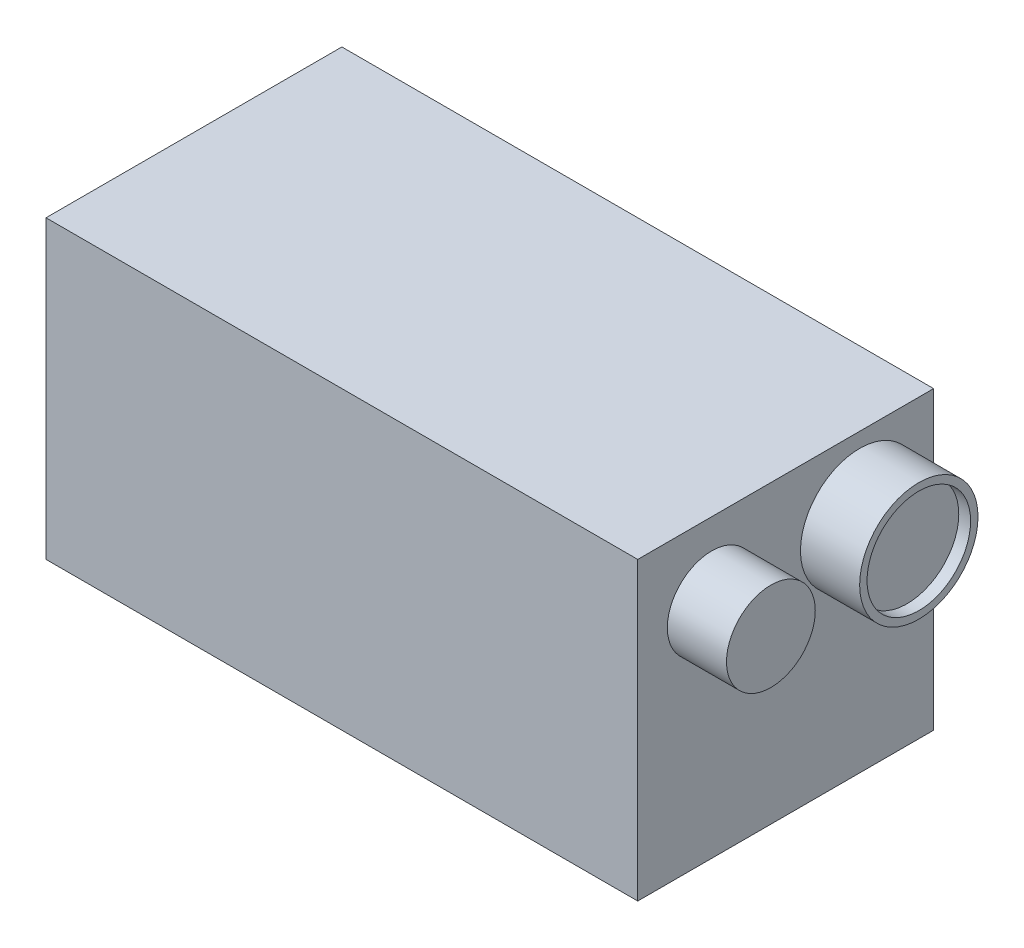
ISO-10303-21;
HEADER;
FILE_DESCRIPTION(('STEP AP214'),'2;1');
FILE_NAME('part.step','',(''),(''),'','','');
FILE_SCHEMA(('AUTOMOTIVE_DESIGN { 1 0 10303 214 1 1 1 1 }'));
ENDSEC;
DATA;
#1=APPLICATION_CONTEXT('core data for automotive mechanical design processes');
#2=APPLICATION_PROTOCOL_DEFINITION('international standard','automotive_design',2000,#1);
#3=PRODUCT_CONTEXT('',#1,'mechanical');
#4=PRODUCT('Part','Part','',(#3));
#5=PRODUCT_RELATED_PRODUCT_CATEGORY('part','',(#4));
#6=PRODUCT_DEFINITION_FORMATION('','',#4);
#7=PRODUCT_DEFINITION_CONTEXT('part definition',#1,'design');
#8=PRODUCT_DEFINITION('design','',#6,#7);
#9=PRODUCT_DEFINITION_SHAPE('','',#8);
#10=(LENGTH_UNIT() NAMED_UNIT(*) SI_UNIT(.MILLI.,.METRE.));
#11=(NAMED_UNIT(*) PLANE_ANGLE_UNIT() SI_UNIT($,.RADIAN.));
#12=(NAMED_UNIT(*) SI_UNIT($,.STERADIAN.) SOLID_ANGLE_UNIT());
#13=UNCERTAINTY_MEASURE_WITH_UNIT(LENGTH_MEASURE(1.E-05),#10,'distance_accuracy_value','');
#14=(GEOMETRIC_REPRESENTATION_CONTEXT(3) GLOBAL_UNCERTAINTY_ASSIGNED_CONTEXT((#13)) GLOBAL_UNIT_ASSIGNED_CONTEXT((#10,
#11,#12)) REPRESENTATION_CONTEXT('',''));
#15=CARTESIAN_POINT('',(0.,0.,0.));
#16=DIRECTION('',(0.,0.,1.));
#17=DIRECTION('',(1.,0.,0.));
#18=AXIS2_PLACEMENT_3D('',#15,#16,#17);
#19=CARTESIAN_POINT('',(-50.,-25.,25.));
#20=DIRECTION('',(1.,0.,0.));
#21=DIRECTION('',(0.,0.,-1.));
#22=AXIS2_PLACEMENT_3D('',#19,#20,#21);
#23=PLANE('',#22);
#24=DIRECTION('',(0.,-1.,0.));
#25=VECTOR('',#24,1.);
#26=CARTESIAN_POINT('',(-50.,-25.,-25.));
#27=LINE('',#26,#25);
#28=CARTESIAN_POINT('',(-50.,25.,-25.));
#29=VERTEX_POINT('',#28);
#30=CARTESIAN_POINT('',(-50.,-25.,-25.));
#31=VERTEX_POINT('',#30);
#32=EDGE_CURVE('E111',#29,#31,#27,.T.);
#33=ORIENTED_EDGE('',*,*,#32,.T.);
#34=DIRECTION('',(0.,0.,-1.));
#35=VECTOR('',#34,1.);
#36=CARTESIAN_POINT('',(-50.,-25.,25.));
#37=LINE('',#36,#35);
#38=CARTESIAN_POINT('',(-50.,-25.,25.));
#39=VERTEX_POINT('',#38);
#40=EDGE_CURVE('E100',#39,#31,#37,.T.);
#41=ORIENTED_EDGE('',*,*,#40,.F.);
#42=DIRECTION('',(0.,-1.,0.));
#43=VECTOR('',#42,1.);
#44=CARTESIAN_POINT('',(-50.,-25.,25.));
#45=LINE('',#44,#43);
#46=CARTESIAN_POINT('',(-50.,25.,25.));
#47=VERTEX_POINT('',#46);
#48=EDGE_CURVE('E92',#47,#39,#45,.T.);
#49=ORIENTED_EDGE('',*,*,#48,.F.);
#50=DIRECTION('',(0.,0.,-1.));
#51=VECTOR('',#50,1.);
#52=CARTESIAN_POINT('',(-50.,25.,25.));
#53=LINE('',#52,#51);
#54=EDGE_CURVE('E107',#47,#29,#53,.T.);
#55=ORIENTED_EDGE('',*,*,#54,.T.);
#56=EDGE_LOOP('',(#33,#41,#49,#55));
#57=FACE_BOUND('',#56,.T.);
#58=ADVANCED_FACE('F39',(#57),#23,.F.);
#59=CARTESIAN_POINT('',(50.,-25.,25.));
#60=DIRECTION('',(0.,1.,0.));
#61=DIRECTION('',(-1.,0.,0.));
#62=AXIS2_PLACEMENT_3D('',#59,#60,#61);
#63=PLANE('',#62);
#64=DIRECTION('',(1.,0.,0.));
#65=VECTOR('',#64,1.);
#66=CARTESIAN_POINT('',(50.,-25.,-25.));
#67=LINE('',#66,#65);
#68=CARTESIAN_POINT('',(50.,-25.,-25.));
#69=VERTEX_POINT('',#68);
#70=EDGE_CURVE('E98',#31,#69,#67,.T.);
#71=ORIENTED_EDGE('',*,*,#70,.T.);
#72=DIRECTION('',(0.,0.,-1.));
#73=VECTOR('',#72,1.);
#74=CARTESIAN_POINT('',(50.,-25.,25.));
#75=LINE('',#74,#73);
#76=CARTESIAN_POINT('',(50.,-25.,25.));
#77=VERTEX_POINT('',#76);
#78=EDGE_CURVE('E96',#77,#69,#75,.T.);
#79=ORIENTED_EDGE('',*,*,#78,.F.);
#80=DIRECTION('',(1.,0.,0.));
#81=VECTOR('',#80,1.);
#82=CARTESIAN_POINT('',(50.,-25.,25.));
#83=LINE('',#82,#81);
#84=EDGE_CURVE('E87',#39,#77,#83,.T.);
#85=ORIENTED_EDGE('',*,*,#84,.F.);
#86=ORIENTED_EDGE('',*,*,#40,.T.);
#87=EDGE_LOOP('',(#71,#79,#85,#86));
#88=FACE_BOUND('',#87,.T.);
#89=ADVANCED_FACE('F97',(#88),#63,.F.);
#90=CARTESIAN_POINT('',(50.,-25.,25.));
#91=DIRECTION('',(-1.,0.,0.));
#92=DIRECTION('',(0.,0.,1.));
#93=AXIS2_PLACEMENT_3D('',#90,#91,#92);
#94=PLANE('',#93);
#95=CARTESIAN_POINT('',(50.,12.5,-12.5));
#96=DIRECTION('',(-1.,0.,0.));
#97=DIRECTION('',(0.,0.,1.));
#98=AXIS2_PLACEMENT_3D('',#95,#96,#97);
#99=CIRCLE('',#98,10.);
#100=CARTESIAN_POINT('',(50.,12.5,-2.5));
#101=VERTEX_POINT('',#100);
#102=EDGE_CURVE('E11',#101,#101,#99,.F.);
#103=ORIENTED_EDGE('',*,*,#102,.F.);
#104=EDGE_LOOP('',(#103));
#105=FACE_BOUND('',#104,.T.);
#106=CARTESIAN_POINT('',(50.,12.5,12.5));
#107=DIRECTION('',(-1.,0.,0.));
#108=DIRECTION('',(0.,0.,1.));
#109=AXIS2_PLACEMENT_3D('',#106,#107,#108);
#110=CIRCLE('',#109,7.5);
#111=CARTESIAN_POINT('',(50.,12.5,20.));
#112=VERTEX_POINT('',#111);
#113=EDGE_CURVE('E48',#112,#112,#110,.F.);
#114=ORIENTED_EDGE('',*,*,#113,.F.);
#115=EDGE_LOOP('',(#114));
#116=FACE_BOUND('',#115,.T.);
#117=DIRECTION('',(0.,1.,0.));
#118=VECTOR('',#117,1.);
#119=CARTESIAN_POINT('',(50.,-25.,-25.));
#120=LINE('',#119,#118);
#121=CARTESIAN_POINT('',(50.,25.,-25.));
#122=VERTEX_POINT('',#121);
#123=EDGE_CURVE('E73',#69,#122,#120,.T.);
#124=ORIENTED_EDGE('',*,*,#123,.T.);
#125=DIRECTION('',(0.,0.,-1.));
#126=VECTOR('',#125,1.);
#127=CARTESIAN_POINT('',(50.,25.,25.));
#128=LINE('',#127,#126);
#129=CARTESIAN_POINT('',(50.,25.,25.));
#130=VERTEX_POINT('',#129);
#131=EDGE_CURVE('E101',#130,#122,#128,.T.);
#132=ORIENTED_EDGE('',*,*,#131,.F.);
#133=DIRECTION('',(0.,1.,0.));
#134=VECTOR('',#133,1.);
#135=CARTESIAN_POINT('',(50.,-25.,25.));
#136=LINE('',#135,#134);
#137=EDGE_CURVE('E90',#77,#130,#136,.T.);
#138=ORIENTED_EDGE('',*,*,#137,.F.);
#139=ORIENTED_EDGE('',*,*,#78,.T.);
#140=EDGE_LOOP('',(#124,#132,#138,#139));
#141=FACE_BOUND('',#140,.T.);
#142=ADVANCED_FACE('F103',(#105,#116,#141),#94,.F.);
#143=CARTESIAN_POINT('',(50.,25.,25.));
#144=DIRECTION('',(0.,-1.,0.));
#145=DIRECTION('',(1.,0.,0.));
#146=AXIS2_PLACEMENT_3D('',#143,#144,#145);
#147=PLANE('',#146);
#148=DIRECTION('',(-1.,0.,0.));
#149=VECTOR('',#148,1.);
#150=CARTESIAN_POINT('',(50.,25.,-25.));
#151=LINE('',#150,#149);
#152=EDGE_CURVE('E79',#122,#29,#151,.T.);
#153=ORIENTED_EDGE('',*,*,#152,.T.);
#154=ORIENTED_EDGE('',*,*,#54,.F.);
#155=DIRECTION('',(-1.,0.,0.));
#156=VECTOR('',#155,1.);
#157=CARTESIAN_POINT('',(50.,25.,25.));
#158=LINE('',#157,#156);
#159=EDGE_CURVE('E56',#130,#47,#158,.T.);
#160=ORIENTED_EDGE('',*,*,#159,.F.);
#161=ORIENTED_EDGE('',*,*,#131,.T.);
#162=EDGE_LOOP('',(#153,#154,#160,#161));
#163=FACE_BOUND('',#162,.T.);
#164=ADVANCED_FACE('F134',(#163),#147,.F.);
#165=CARTESIAN_POINT('',(0.,0.,25.));
#166=DIRECTION('',(0.,0.,1.));
#167=DIRECTION('',(1.,0.,0.));
#168=AXIS2_PLACEMENT_3D('',#165,#166,#167);
#169=PLANE('',#168);
#170=ORIENTED_EDGE('',*,*,#48,.T.);
#171=ORIENTED_EDGE('',*,*,#84,.T.);
#172=ORIENTED_EDGE('',*,*,#137,.T.);
#173=ORIENTED_EDGE('',*,*,#159,.T.);
#174=EDGE_LOOP('',(#170,#171,#172,#173));
#175=FACE_BOUND('',#174,.T.);
#176=ADVANCED_FACE('F88',(#175),#169,.T.);
#177=CARTESIAN_POINT('',(0.,0.,-25.));
#178=DIRECTION('',(0.,0.,1.));
#179=DIRECTION('',(1.,0.,0.));
#180=AXIS2_PLACEMENT_3D('',#177,#178,#179);
#181=PLANE('',#180);
#182=ORIENTED_EDGE('',*,*,#32,.F.);
#183=ORIENTED_EDGE('',*,*,#152,.F.);
#184=ORIENTED_EDGE('',*,*,#123,.F.);
#185=ORIENTED_EDGE('',*,*,#70,.F.);
#186=EDGE_LOOP('',(#182,#183,#184,#185));
#187=FACE_BOUND('',#186,.T.);
#188=ADVANCED_FACE('F149',(#187),#181,.F.);
#189=CARTESIAN_POINT('',(60.,12.5,12.5));
#190=DIRECTION('',(-1.,0.,0.));
#191=DIRECTION('',(0.,0.,1.));
#192=AXIS2_PLACEMENT_3D('',#189,#190,#191);
#193=CYLINDRICAL_SURFACE('',#192,7.5);
#194=CARTESIAN_POINT('',(60.,12.5,12.5));
#195=DIRECTION('',(1.,0.,0.));
#196=DIRECTION('',(0.,0.,-1.));
#197=AXIS2_PLACEMENT_3D('',#194,#195,#196);
#198=CIRCLE('',#197,7.5);
#199=CARTESIAN_POINT('',(60.,12.5,5.));
#200=VERTEX_POINT('',#199);
#201=EDGE_CURVE('E115',#200,#200,#198,.T.);
#202=ORIENTED_EDGE('',*,*,#201,.F.);
#203=EDGE_LOOP('',(#202));
#204=FACE_BOUND('',#203,.T.);
#205=ORIENTED_EDGE('',*,*,#113,.T.);
#206=EDGE_LOOP('',(#205));
#207=FACE_BOUND('',#206,.T.);
#208=ADVANCED_FACE('F131',(#204,#207),#193,.T.);
#209=CARTESIAN_POINT('',(60.,12.5,12.5));
#210=DIRECTION('',(1.,0.,0.));
#211=DIRECTION('',(0.,0.,-1.));
#212=AXIS2_PLACEMENT_3D('',#209,#210,#211);
#213=PLANE('',#212);
#214=ORIENTED_EDGE('',*,*,#201,.T.);
#215=EDGE_LOOP('',(#214));
#216=FACE_BOUND('',#215,.T.);
#217=ADVANCED_FACE('F156',(#216),#213,.T.);
#218=CARTESIAN_POINT('',(60.,12.5,-12.5));
#219=DIRECTION('',(-1.,0.,0.));
#220=DIRECTION('',(0.,0.,1.));
#221=AXIS2_PLACEMENT_3D('',#218,#219,#220);
#222=CYLINDRICAL_SURFACE('',#221,10.);
#223=CARTESIAN_POINT('',(60.,12.5,-12.5));
#224=DIRECTION('',(1.,0.,0.));
#225=DIRECTION('',(0.,0.,-1.));
#226=AXIS2_PLACEMENT_3D('',#223,#224,#225);
#227=CIRCLE('',#226,10.);
#228=CARTESIAN_POINT('',(60.,12.5,-22.5));
#229=VERTEX_POINT('',#228);
#230=EDGE_CURVE('E185',#229,#229,#227,.T.);
#231=ORIENTED_EDGE('',*,*,#230,.F.);
#232=EDGE_LOOP('',(#231));
#233=FACE_BOUND('',#232,.T.);
#234=ORIENTED_EDGE('',*,*,#102,.T.);
#235=EDGE_LOOP('',(#234));
#236=FACE_BOUND('',#235,.T.);
#237=ADVANCED_FACE('F163',(#233,#236),#222,.T.);
#238=CARTESIAN_POINT('',(60.,12.5,-12.5));
#239=DIRECTION('',(1.,0.,0.));
#240=DIRECTION('',(0.,0.,-1.));
#241=AXIS2_PLACEMENT_3D('',#238,#239,#240);
#242=PLANE('',#241);
#243=CARTESIAN_POINT('',(60.,12.5,-12.5));
#244=DIRECTION('',(1.,0.,0.));
#245=DIRECTION('',(0.,0.,-1.));
#246=AXIS2_PLACEMENT_3D('',#243,#244,#245);
#247=CIRCLE('',#246,8.75);
#248=CARTESIAN_POINT('',(60.,12.5,-21.25));
#249=VERTEX_POINT('',#248);
#250=EDGE_CURVE('E186',#249,#249,#247,.T.);
#251=ORIENTED_EDGE('',*,*,#250,.F.);
#252=EDGE_LOOP('',(#251));
#253=FACE_BOUND('',#252,.T.);
#254=ORIENTED_EDGE('',*,*,#230,.T.);
#255=EDGE_LOOP('',(#254));
#256=FACE_BOUND('',#255,.T.);
#257=ADVANCED_FACE('F165',(#253,#256),#242,.T.);
#258=CARTESIAN_POINT('',(58.,12.5,-12.5));
#259=DIRECTION('',(1.,0.,0.));
#260=DIRECTION('',(0.,0.,-1.));
#261=AXIS2_PLACEMENT_3D('',#258,#259,#260);
#262=CYLINDRICAL_SURFACE('',#261,8.75);
#263=CARTESIAN_POINT('',(58.,12.5,-12.5));
#264=DIRECTION('',(1.,0.,0.));
#265=DIRECTION('',(0.,0.,-1.));
#266=AXIS2_PLACEMENT_3D('',#263,#264,#265);
#267=CIRCLE('',#266,8.75);
#268=CARTESIAN_POINT('',(58.,12.5,-21.25));
#269=VERTEX_POINT('',#268);
#270=EDGE_CURVE('E183',#269,#269,#267,.T.);
#271=ORIENTED_EDGE('',*,*,#270,.F.);
#272=EDGE_LOOP('',(#271));
#273=FACE_BOUND('',#272,.T.);
#274=ORIENTED_EDGE('',*,*,#250,.T.);
#275=EDGE_LOOP('',(#274));
#276=FACE_BOUND('',#275,.T.);
#277=ADVANCED_FACE('F168',(#273,#276),#262,.F.);
#278=CARTESIAN_POINT('',(58.,0.,0.));
#279=DIRECTION('',(1.,0.,0.));
#280=DIRECTION('',(0.,0.,-1.));
#281=AXIS2_PLACEMENT_3D('',#278,#279,#280);
#282=PLANE('',#281);
#283=ORIENTED_EDGE('',*,*,#270,.T.);
#284=EDGE_LOOP('',(#283));
#285=FACE_BOUND('',#284,.T.);
#286=ADVANCED_FACE('F175',(#285),#282,.T.);
#287=CLOSED_SHELL('',(#58,#89,#142,#164,#176,#188,#208,#217,#237,#257,#277,#286));
#288=MANIFOLD_SOLID_BREP('B2',#287);
#289=ADVANCED_BREP_SHAPE_REPRESENTATION('',(#18,#288),#14);
#290=SHAPE_DEFINITION_REPRESENTATION(#9,#289);
ENDSEC;
END-ISO-10303-21;
